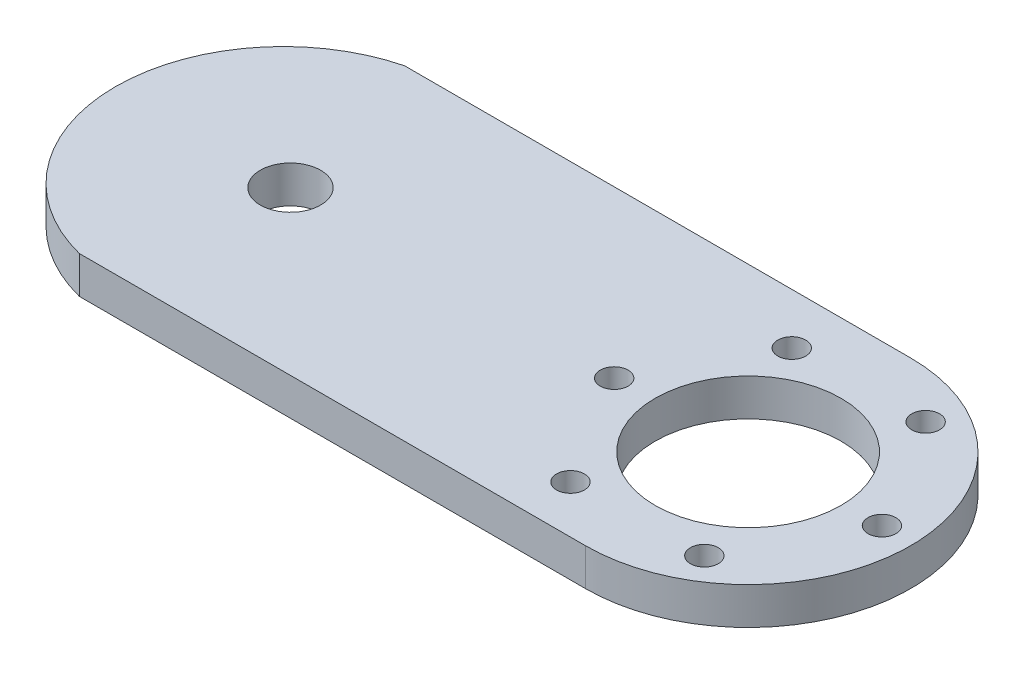
ISO-10303-21;
HEADER;
FILE_DESCRIPTION(('STEP AP214'),'2;1');
FILE_NAME('part.step','',(''),(''),'','','');
FILE_SCHEMA(('AUTOMOTIVE_DESIGN { 1 0 10303 214 1 1 1 1 }'));
ENDSEC;
DATA;
#1=APPLICATION_CONTEXT('core data for automotive mechanical design processes');
#2=APPLICATION_PROTOCOL_DEFINITION('international standard','automotive_design',2000,#1);
#3=PRODUCT_CONTEXT('',#1,'mechanical');
#4=PRODUCT('Part','Part','',(#3));
#5=PRODUCT_RELATED_PRODUCT_CATEGORY('part','',(#4));
#6=PRODUCT_DEFINITION_FORMATION('','',#4);
#7=PRODUCT_DEFINITION_CONTEXT('part definition',#1,'design');
#8=PRODUCT_DEFINITION('design','',#6,#7);
#9=PRODUCT_DEFINITION_SHAPE('','',#8);
#10=(LENGTH_UNIT() NAMED_UNIT(*) SI_UNIT(.MILLI.,.METRE.));
#11=(NAMED_UNIT(*) PLANE_ANGLE_UNIT() SI_UNIT($,.RADIAN.));
#12=(NAMED_UNIT(*) SI_UNIT($,.STERADIAN.) SOLID_ANGLE_UNIT());
#13=UNCERTAINTY_MEASURE_WITH_UNIT(LENGTH_MEASURE(1.E-05),#10,'distance_accuracy_value','');
#14=(GEOMETRIC_REPRESENTATION_CONTEXT(3) GLOBAL_UNCERTAINTY_ASSIGNED_CONTEXT((#13)) GLOBAL_UNIT_ASSIGNED_CONTEXT((#10,
#11,#12)) REPRESENTATION_CONTEXT('',''));
#15=CARTESIAN_POINT('',(0.,0.,0.));
#16=DIRECTION('',(0.,0.,1.));
#17=DIRECTION('',(1.,0.,0.));
#18=AXIS2_PLACEMENT_3D('',#15,#16,#17);
#19=CARTESIAN_POINT('',(110.672099026258,8.,16.4833865027268));
#20=DIRECTION('',(0.,1.,0.));
#21=DIRECTION('',(0.,0.,1.));
#22=AXIS2_PLACEMENT_3D('',#19,#20,#21);
#23=PLANE('',#22);
#24=CARTESIAN_POINT('',(82.5123393071386,8.,17.1509572820945));
#25=DIRECTION('',(0.,1.,0.));
#26=DIRECTION('',(0.,0.,1.));
#27=AXIS2_PLACEMENT_3D('',#24,#25,#26);
#28=CIRCLE('',#27,3.00000000000001);
#29=CARTESIAN_POINT('',(82.5123393071386,8.,20.1509572820945));
#30=VERTEX_POINT('',#29);
#31=EDGE_CURVE('E135',#30,#30,#28,.T.);
#32=ORIENTED_EDGE('',*,*,#31,.F.);
#33=EDGE_LOOP('',(#32));
#34=FACE_BOUND('',#33,.T.);
#35=CARTESIAN_POINT('',(97.1613591782707,8.,41.2077127985249));
#36=DIRECTION('',(0.,1.,0.));
#37=DIRECTION('',(0.,0.,1.));
#38=AXIS2_PLACEMENT_3D('',#35,#36,#37);
#39=CIRCLE('',#38,2.99999999999999);
#40=CARTESIAN_POINT('',(97.1613591782707,8.,44.2077127985248));
#41=VERTEX_POINT('',#40);
#42=EDGE_CURVE('E125',#41,#41,#39,.T.);
#43=ORIENTED_EDGE('',*,*,#42,.F.);
#44=EDGE_LOOP('',(#43));
#45=FACE_BOUND('',#44,.T.);
#46=CARTESIAN_POINT('',(125.319630523697,8.,40.5496672077967));
#47=DIRECTION('',(0.,1.,0.));
#48=DIRECTION('',(0.,0.,1.));
#49=AXIS2_PLACEMENT_3D('',#46,#47,#48);
#50=CIRCLE('',#49,2.99999999999999);
#51=CARTESIAN_POINT('',(125.319630523697,8.,43.5496672077967));
#52=VERTEX_POINT('',#51);
#53=EDGE_CURVE('E122',#52,#52,#50,.T.);
#54=ORIENTED_EDGE('',*,*,#53,.F.);
#55=EDGE_LOOP('',(#54));
#56=FACE_BOUND('',#55,.T.);
#57=CARTESIAN_POINT('',(138.828881997991,8.,15.834866100638));
#58=DIRECTION('',(0.,1.,0.));
#59=DIRECTION('',(0.,0.,1.));
#60=AXIS2_PLACEMENT_3D('',#57,#58,#59);
#61=CIRCLE('',#60,2.99999999999999);
#62=CARTESIAN_POINT('',(138.828881997991,8.,18.834866100638));
#63=VERTEX_POINT('',#62);
#64=EDGE_CURVE('E119',#63,#63,#61,.T.);
#65=ORIENTED_EDGE('',*,*,#64,.F.);
#66=EDGE_LOOP('',(#65));
#67=FACE_BOUND('',#66,.T.);
#68=CARTESIAN_POINT('',(124.179862126859,8.,-8.22188941579235));
#69=DIRECTION('',(0.,1.,0.));
#70=DIRECTION('',(0.,0.,1.));
#71=AXIS2_PLACEMENT_3D('',#68,#69,#70);
#72=CIRCLE('',#71,3.00000000000002);
#73=CARTESIAN_POINT('',(124.179862126859,8.,-5.22188941579233));
#74=VERTEX_POINT('',#73);
#75=EDGE_CURVE('E115',#74,#74,#72,.T.);
#76=ORIENTED_EDGE('',*,*,#75,.F.);
#77=EDGE_LOOP('',(#76));
#78=FACE_BOUND('',#77,.T.);
#79=CARTESIAN_POINT('',(96.0215907814327,8.,-7.56384382506414));
#80=DIRECTION('',(0.,1.,0.));
#81=DIRECTION('',(0.,0.,1.));
#82=AXIS2_PLACEMENT_3D('',#79,#80,#81);
#83=CIRCLE('',#82,3.00000000000001);
#84=CARTESIAN_POINT('',(96.0215907814327,8.,-4.56384382506413));
#85=VERTEX_POINT('',#84);
#86=EDGE_CURVE('E111',#85,#85,#83,.T.);
#87=ORIENTED_EDGE('',*,*,#86,.F.);
#88=EDGE_LOOP('',(#87));
#89=FACE_BOUND('',#88,.T.);
#90=CARTESIAN_POINT('',(110.670387558773,8.,16.4833865027268));
#91=DIRECTION('',(0.,1.,0.));
#92=DIRECTION('',(0.,0.,1.));
#93=AXIS2_PLACEMENT_3D('',#90,#91,#92);
#94=CIRCLE('',#93,20.);
#95=CARTESIAN_POINT('',(110.670387558773,8.,36.4833865027268));
#96=VERTEX_POINT('',#95);
#97=EDGE_CURVE('E101',#96,#96,#94,.T.);
#98=ORIENTED_EDGE('',*,*,#97,.F.);
#99=EDGE_LOOP('',(#98));
#100=FACE_BOUND('',#99,.T.);
#101=CARTESIAN_POINT('',(110.672099026258,8.,16.4833865027268));
#102=DIRECTION('',(0.,1.,0.));
#103=DIRECTION('',(0.,0.,1.));
#104=AXIS2_PLACEMENT_3D('',#101,#102,#103);
#105=CIRCLE('',#104,35.);
#106=CARTESIAN_POINT('',(110.672099026258,8.,51.4833865027268));
#107=VERTEX_POINT('',#106);
#108=CARTESIAN_POINT('',(110.672099026258,8.,-18.5166134972732));
#109=VERTEX_POINT('',#108);
#110=EDGE_CURVE('E85',#107,#109,#105,.T.);
#111=ORIENTED_EDGE('',*,*,#110,.T.);
#112=DIRECTION('',(-1.,0.,0.));
#113=VECTOR('',#112,1.);
#114=CARTESIAN_POINT('',(1.73855637381506,8.,-18.5166134972733));
#115=LINE('',#114,#113);
#116=CARTESIAN_POINT('',(1.73855637381505,8.,-18.5166134972732));
#117=VERTEX_POINT('',#116);
#118=EDGE_CURVE('E80',#109,#117,#115,.T.);
#119=ORIENTED_EDGE('',*,*,#118,.T.);
#120=CARTESIAN_POINT('',(10.6068033832549,8.,16.4833865027268));
#121=DIRECTION('',(0.,1.,0.));
#122=DIRECTION('',(0.,0.,-1.));
#123=AXIS2_PLACEMENT_3D('',#120,#121,#122);
#124=CIRCLE('',#123,36.1060355760701);
#125=CARTESIAN_POINT('',(1.73855637381506,8.,51.4833865027268));
#126=VERTEX_POINT('',#125);
#127=EDGE_CURVE('E83',#117,#126,#124,.T.);
#128=ORIENTED_EDGE('',*,*,#127,.T.);
#129=DIRECTION('',(1.,0.,0.));
#130=VECTOR('',#129,1.);
#131=CARTESIAN_POINT('',(1.73855637381506,8.,51.4833865027268));
#132=LINE('',#131,#130);
#133=EDGE_CURVE('E50',#126,#107,#132,.T.);
#134=ORIENTED_EDGE('',*,*,#133,.T.);
#135=EDGE_LOOP('',(#111,#119,#128,#134));
#136=FACE_BOUND('',#135,.T.);
#137=CARTESIAN_POINT('',(12.1653256458956,8.,16.4833865027268));
#138=DIRECTION('',(0.,1.,0.));
#139=DIRECTION('',(0.,0.,1.));
#140=AXIS2_PLACEMENT_3D('',#137,#138,#139);
#141=CIRCLE('',#140,6.5);
#142=CARTESIAN_POINT('',(12.1653256458956,8.,22.9833865027268));
#143=VERTEX_POINT('',#142);
#144=EDGE_CURVE('E144',#143,#143,#141,.T.);
#145=ORIENTED_EDGE('',*,*,#144,.F.);
#146=EDGE_LOOP('',(#145));
#147=FACE_BOUND('',#146,.T.);
#148=ADVANCED_FACE('F31',(#34,#45,#56,#67,#78,#89,#100,#136,#147),#23,.T.);
#149=CARTESIAN_POINT('',(110.672099026258,0.,16.4833865027268));
#150=DIRECTION('',(0.,1.,0.));
#151=DIRECTION('',(0.,0.,1.));
#152=AXIS2_PLACEMENT_3D('',#149,#150,#151);
#153=PLANE('',#152);
#154=CARTESIAN_POINT('',(82.5123393071386,0.,17.1509572820945));
#155=DIRECTION('',(0.,1.,0.));
#156=DIRECTION('',(0.,0.,1.));
#157=AXIS2_PLACEMENT_3D('',#154,#155,#156);
#158=CIRCLE('',#157,3.00000000000001);
#159=CARTESIAN_POINT('',(82.5123393071386,0.,20.1509572820945));
#160=VERTEX_POINT('',#159);
#161=EDGE_CURVE('E35',#160,#160,#158,.T.);
#162=ORIENTED_EDGE('',*,*,#161,.T.);
#163=EDGE_LOOP('',(#162));
#164=FACE_BOUND('',#163,.T.);
#165=CARTESIAN_POINT('',(97.1613591782707,0.,41.2077127985249));
#166=DIRECTION('',(0.,1.,0.));
#167=DIRECTION('',(0.,0.,1.));
#168=AXIS2_PLACEMENT_3D('',#165,#166,#167);
#169=CIRCLE('',#168,2.99999999999999);
#170=CARTESIAN_POINT('',(97.1613591782707,0.,44.2077127985248));
#171=VERTEX_POINT('',#170);
#172=EDGE_CURVE('E123',#171,#171,#169,.T.);
#173=ORIENTED_EDGE('',*,*,#172,.T.);
#174=EDGE_LOOP('',(#173));
#175=FACE_BOUND('',#174,.T.);
#176=CARTESIAN_POINT('',(125.319630523697,0.,40.5496672077967));
#177=DIRECTION('',(0.,1.,0.));
#178=DIRECTION('',(0.,0.,1.));
#179=AXIS2_PLACEMENT_3D('',#176,#177,#178);
#180=CIRCLE('',#179,2.99999999999999);
#181=CARTESIAN_POINT('',(125.319630523697,0.,43.5496672077967));
#182=VERTEX_POINT('',#181);
#183=EDGE_CURVE('E120',#182,#182,#180,.T.);
#184=ORIENTED_EDGE('',*,*,#183,.T.);
#185=EDGE_LOOP('',(#184));
#186=FACE_BOUND('',#185,.T.);
#187=CARTESIAN_POINT('',(138.828881997991,0.,15.834866100638));
#188=DIRECTION('',(0.,1.,0.));
#189=DIRECTION('',(0.,0.,1.));
#190=AXIS2_PLACEMENT_3D('',#187,#188,#189);
#191=CIRCLE('',#190,2.99999999999999);
#192=CARTESIAN_POINT('',(138.828881997991,0.,18.834866100638));
#193=VERTEX_POINT('',#192);
#194=EDGE_CURVE('E116',#193,#193,#191,.T.);
#195=ORIENTED_EDGE('',*,*,#194,.T.);
#196=EDGE_LOOP('',(#195));
#197=FACE_BOUND('',#196,.T.);
#198=CARTESIAN_POINT('',(124.179862126859,0.,-8.22188941579235));
#199=DIRECTION('',(0.,1.,0.));
#200=DIRECTION('',(0.,0.,1.));
#201=AXIS2_PLACEMENT_3D('',#198,#199,#200);
#202=CIRCLE('',#201,3.00000000000002);
#203=CARTESIAN_POINT('',(124.179862126859,0.,-5.22188941579233));
#204=VERTEX_POINT('',#203);
#205=EDGE_CURVE('E112',#204,#204,#202,.T.);
#206=ORIENTED_EDGE('',*,*,#205,.T.);
#207=EDGE_LOOP('',(#206));
#208=FACE_BOUND('',#207,.T.);
#209=CARTESIAN_POINT('',(96.0215907814327,0.,-7.56384382506414));
#210=DIRECTION('',(0.,1.,0.));
#211=DIRECTION('',(0.,0.,1.));
#212=AXIS2_PLACEMENT_3D('',#209,#210,#211);
#213=CIRCLE('',#212,3.00000000000001);
#214=CARTESIAN_POINT('',(96.0215907814327,0.,-4.56384382506413));
#215=VERTEX_POINT('',#214);
#216=EDGE_CURVE('E107',#215,#215,#213,.T.);
#217=ORIENTED_EDGE('',*,*,#216,.T.);
#218=EDGE_LOOP('',(#217));
#219=FACE_BOUND('',#218,.T.);
#220=CARTESIAN_POINT('',(110.670387558773,0.,16.4833865027268));
#221=DIRECTION('',(0.,1.,0.));
#222=DIRECTION('',(0.,0.,1.));
#223=AXIS2_PLACEMENT_3D('',#220,#221,#222);
#224=CIRCLE('',#223,20.);
#225=CARTESIAN_POINT('',(110.670387558773,0.,36.4833865027268));
#226=VERTEX_POINT('',#225);
#227=EDGE_CURVE('E147',#226,#226,#224,.T.);
#228=ORIENTED_EDGE('',*,*,#227,.T.);
#229=EDGE_LOOP('',(#228));
#230=FACE_BOUND('',#229,.T.);
#231=CARTESIAN_POINT('',(110.672099026258,0.,16.4833865027268));
#232=DIRECTION('',(0.,1.,0.));
#233=DIRECTION('',(0.,0.,1.));
#234=AXIS2_PLACEMENT_3D('',#231,#232,#233);
#235=CIRCLE('',#234,35.);
#236=CARTESIAN_POINT('',(110.672099026258,0.,51.4833865027268));
#237=VERTEX_POINT('',#236);
#238=CARTESIAN_POINT('',(110.672099026258,0.,-18.5166134972732));
#239=VERTEX_POINT('',#238);
#240=EDGE_CURVE('E98',#237,#239,#235,.T.);
#241=ORIENTED_EDGE('',*,*,#240,.F.);
#242=DIRECTION('',(1.,0.,0.));
#243=VECTOR('',#242,1.);
#244=CARTESIAN_POINT('',(1.73855637381506,0.,51.4833865027268));
#245=LINE('',#244,#243);
#246=CARTESIAN_POINT('',(1.73855637381506,0.,51.4833865027268));
#247=VERTEX_POINT('',#246);
#248=EDGE_CURVE('E73',#247,#237,#245,.T.);
#249=ORIENTED_EDGE('',*,*,#248,.F.);
#250=CARTESIAN_POINT('',(10.6068033832549,0.,16.4833865027268));
#251=DIRECTION('',(0.,1.,0.));
#252=DIRECTION('',(0.,0.,-1.));
#253=AXIS2_PLACEMENT_3D('',#250,#251,#252);
#254=CIRCLE('',#253,36.1060355760701);
#255=CARTESIAN_POINT('',(1.73855637381505,0.,-18.5166134972732));
#256=VERTEX_POINT('',#255);
#257=EDGE_CURVE('E67',#256,#247,#254,.T.);
#258=ORIENTED_EDGE('',*,*,#257,.F.);
#259=DIRECTION('',(-1.,0.,0.));
#260=VECTOR('',#259,1.);
#261=CARTESIAN_POINT('',(1.73855637381506,0.,-18.5166134972733));
#262=LINE('',#261,#260);
#263=EDGE_CURVE('E89',#239,#256,#262,.T.);
#264=ORIENTED_EDGE('',*,*,#263,.F.);
#265=EDGE_LOOP('',(#241,#249,#258,#264));
#266=FACE_BOUND('',#265,.T.);
#267=CARTESIAN_POINT('',(12.1653256458956,0.,16.4833865027268));
#268=DIRECTION('',(0.,1.,0.));
#269=DIRECTION('',(0.,0.,1.));
#270=AXIS2_PLACEMENT_3D('',#267,#268,#269);
#271=CIRCLE('',#270,6.5);
#272=CARTESIAN_POINT('',(12.1653256458956,0.,22.9833865027268));
#273=VERTEX_POINT('',#272);
#274=EDGE_CURVE('E110',#273,#273,#271,.T.);
#275=ORIENTED_EDGE('',*,*,#274,.T.);
#276=EDGE_LOOP('',(#275));
#277=FACE_BOUND('',#276,.T.);
#278=ADVANCED_FACE('F155',(#164,#175,#186,#197,#208,#219,#230,#266,#277),#153,.F.);
#279=CARTESIAN_POINT('',(110.672099026258,8.,16.4833865027268));
#280=DIRECTION('',(0.,-1.,0.));
#281=DIRECTION('',(0.,0.,-1.));
#282=AXIS2_PLACEMENT_3D('',#279,#280,#281);
#283=CYLINDRICAL_SURFACE('',#282,35.);
#284=ORIENTED_EDGE('',*,*,#240,.T.);
#285=DIRECTION('',(0.,-1.,0.));
#286=VECTOR('',#285,1.);
#287=CARTESIAN_POINT('',(110.672099026258,8.,-18.5166134972732));
#288=LINE('',#287,#286);
#289=EDGE_CURVE('E11',#109,#239,#288,.T.);
#290=ORIENTED_EDGE('',*,*,#289,.F.);
#291=ORIENTED_EDGE('',*,*,#110,.F.);
#292=DIRECTION('',(0.,-1.,0.));
#293=VECTOR('',#292,1.);
#294=CARTESIAN_POINT('',(110.672099026258,8.,51.4833865027268));
#295=LINE('',#294,#293);
#296=EDGE_CURVE('E94',#107,#237,#295,.T.);
#297=ORIENTED_EDGE('',*,*,#296,.T.);
#298=EDGE_LOOP('',(#284,#290,#291,#297));
#299=FACE_BOUND('',#298,.T.);
#300=ADVANCED_FACE('F33',(#299),#283,.T.);
#301=CARTESIAN_POINT('',(1.73855637381506,8.,-18.5166134972733));
#302=DIRECTION('',(0.,0.,1.));
#303=DIRECTION('',(1.,0.,0.));
#304=AXIS2_PLACEMENT_3D('',#301,#302,#303);
#305=PLANE('',#304);
#306=ORIENTED_EDGE('',*,*,#263,.T.);
#307=DIRECTION('',(0.,-1.,0.));
#308=VECTOR('',#307,1.);
#309=CARTESIAN_POINT('',(1.73855637381505,8.,-18.5166134972732));
#310=LINE('',#309,#308);
#311=EDGE_CURVE('E41',#117,#256,#310,.T.);
#312=ORIENTED_EDGE('',*,*,#311,.F.);
#313=ORIENTED_EDGE('',*,*,#118,.F.);
#314=ORIENTED_EDGE('',*,*,#289,.T.);
#315=EDGE_LOOP('',(#306,#312,#313,#314));
#316=FACE_BOUND('',#315,.T.);
#317=ADVANCED_FACE('F88',(#316),#305,.F.);
#318=CARTESIAN_POINT('',(10.6068033832549,8.,16.4833865027268));
#319=DIRECTION('',(0.,-1.,0.));
#320=DIRECTION('',(0.,0.,-1.));
#321=AXIS2_PLACEMENT_3D('',#318,#319,#320);
#322=CYLINDRICAL_SURFACE('',#321,36.1060355760701);
#323=ORIENTED_EDGE('',*,*,#257,.T.);
#324=DIRECTION('',(0.,-1.,0.));
#325=VECTOR('',#324,1.);
#326=CARTESIAN_POINT('',(1.73855637381506,8.,51.4833865027268));
#327=LINE('',#326,#325);
#328=EDGE_CURVE('E90',#126,#247,#327,.T.);
#329=ORIENTED_EDGE('',*,*,#328,.F.);
#330=ORIENTED_EDGE('',*,*,#127,.F.);
#331=ORIENTED_EDGE('',*,*,#311,.T.);
#332=EDGE_LOOP('',(#323,#329,#330,#331));
#333=FACE_BOUND('',#332,.T.);
#334=ADVANCED_FACE('F92',(#333),#322,.T.);
#335=CARTESIAN_POINT('',(1.73855637381506,8.,51.4833865027268));
#336=DIRECTION('',(0.,0.,-1.));
#337=DIRECTION('',(-1.,0.,0.));
#338=AXIS2_PLACEMENT_3D('',#335,#336,#337);
#339=PLANE('',#338);
#340=ORIENTED_EDGE('',*,*,#248,.T.);
#341=ORIENTED_EDGE('',*,*,#296,.F.);
#342=ORIENTED_EDGE('',*,*,#133,.F.);
#343=ORIENTED_EDGE('',*,*,#328,.T.);
#344=EDGE_LOOP('',(#340,#341,#342,#343));
#345=FACE_BOUND('',#344,.T.);
#346=ADVANCED_FACE('F161',(#345),#339,.F.);
#347=CARTESIAN_POINT('',(110.670387558773,8.,16.4833865027268));
#348=DIRECTION('',(0.,-1.,0.));
#349=DIRECTION('',(0.,0.,-1.));
#350=AXIS2_PLACEMENT_3D('',#347,#348,#349);
#351=CYLINDRICAL_SURFACE('',#350,20.);
#352=ORIENTED_EDGE('',*,*,#97,.T.);
#353=EDGE_LOOP('',(#352));
#354=FACE_BOUND('',#353,.T.);
#355=ORIENTED_EDGE('',*,*,#227,.F.);
#356=EDGE_LOOP('',(#355));
#357=FACE_BOUND('',#356,.T.);
#358=ADVANCED_FACE('F158',(#354,#357),#351,.F.);
#359=CARTESIAN_POINT('',(12.1653256458956,8.,16.4833865027268));
#360=DIRECTION('',(0.,-1.,0.));
#361=DIRECTION('',(0.,0.,-1.));
#362=AXIS2_PLACEMENT_3D('',#359,#360,#361);
#363=CYLINDRICAL_SURFACE('',#362,6.5);
#364=ORIENTED_EDGE('',*,*,#144,.T.);
#365=EDGE_LOOP('',(#364));
#366=FACE_BOUND('',#365,.T.);
#367=ORIENTED_EDGE('',*,*,#274,.F.);
#368=EDGE_LOOP('',(#367));
#369=FACE_BOUND('',#368,.T.);
#370=ADVANCED_FACE('F160',(#366,#369),#363,.F.);
#371=CARTESIAN_POINT('',(96.0215907814327,-2.,-7.56384382506414));
#372=DIRECTION('',(0.,1.,0.));
#373=DIRECTION('',(0.,0.,1.));
#374=AXIS2_PLACEMENT_3D('',#371,#372,#373);
#375=CYLINDRICAL_SURFACE('',#374,3.00000000000001);
#376=ORIENTED_EDGE('',*,*,#86,.T.);
#377=EDGE_LOOP('',(#376));
#378=FACE_BOUND('',#377,.T.);
#379=ORIENTED_EDGE('',*,*,#216,.F.);
#380=EDGE_LOOP('',(#379));
#381=FACE_BOUND('',#380,.T.);
#382=ADVANCED_FACE('F168',(#378,#381),#375,.F.);
#383=CARTESIAN_POINT('',(124.179862126859,-2.,-8.22188941579235));
#384=DIRECTION('',(0.,1.,0.));
#385=DIRECTION('',(0.,0.,1.));
#386=AXIS2_PLACEMENT_3D('',#383,#384,#385);
#387=CYLINDRICAL_SURFACE('',#386,3.00000000000002);
#388=ORIENTED_EDGE('',*,*,#75,.T.);
#389=EDGE_LOOP('',(#388));
#390=FACE_BOUND('',#389,.T.);
#391=ORIENTED_EDGE('',*,*,#205,.F.);
#392=EDGE_LOOP('',(#391));
#393=FACE_BOUND('',#392,.T.);
#394=ADVANCED_FACE('F213',(#390,#393),#387,.F.);
#395=CARTESIAN_POINT('',(138.828881997991,-2.,15.834866100638));
#396=DIRECTION('',(0.,1.,0.));
#397=DIRECTION('',(0.,0.,1.));
#398=AXIS2_PLACEMENT_3D('',#395,#396,#397);
#399=CYLINDRICAL_SURFACE('',#398,2.99999999999999);
#400=ORIENTED_EDGE('',*,*,#64,.T.);
#401=EDGE_LOOP('',(#400));
#402=FACE_BOUND('',#401,.T.);
#403=ORIENTED_EDGE('',*,*,#194,.F.);
#404=EDGE_LOOP('',(#403));
#405=FACE_BOUND('',#404,.T.);
#406=ADVANCED_FACE('F224',(#402,#405),#399,.F.);
#407=CARTESIAN_POINT('',(125.319630523697,-2.,40.5496672077967));
#408=DIRECTION('',(0.,1.,0.));
#409=DIRECTION('',(0.,0.,1.));
#410=AXIS2_PLACEMENT_3D('',#407,#408,#409);
#411=CYLINDRICAL_SURFACE('',#410,2.99999999999999);
#412=ORIENTED_EDGE('',*,*,#53,.T.);
#413=EDGE_LOOP('',(#412));
#414=FACE_BOUND('',#413,.T.);
#415=ORIENTED_EDGE('',*,*,#183,.F.);
#416=EDGE_LOOP('',(#415));
#417=FACE_BOUND('',#416,.T.);
#418=ADVANCED_FACE('F234',(#414,#417),#411,.F.);
#419=CARTESIAN_POINT('',(97.1613591782707,-2.,41.2077127985249));
#420=DIRECTION('',(0.,1.,0.));
#421=DIRECTION('',(0.,0.,1.));
#422=AXIS2_PLACEMENT_3D('',#419,#420,#421);
#423=CYLINDRICAL_SURFACE('',#422,2.99999999999999);
#424=ORIENTED_EDGE('',*,*,#42,.T.);
#425=EDGE_LOOP('',(#424));
#426=FACE_BOUND('',#425,.T.);
#427=ORIENTED_EDGE('',*,*,#172,.F.);
#428=EDGE_LOOP('',(#427));
#429=FACE_BOUND('',#428,.T.);
#430=ADVANCED_FACE('F244',(#426,#429),#423,.F.);
#431=CARTESIAN_POINT('',(82.5123393071386,-2.,17.1509572820945));
#432=DIRECTION('',(0.,1.,0.));
#433=DIRECTION('',(0.,0.,1.));
#434=AXIS2_PLACEMENT_3D('',#431,#432,#433);
#435=CYLINDRICAL_SURFACE('',#434,3.00000000000001);
#436=ORIENTED_EDGE('',*,*,#31,.T.);
#437=EDGE_LOOP('',(#436));
#438=FACE_BOUND('',#437,.T.);
#439=ORIENTED_EDGE('',*,*,#161,.F.);
#440=EDGE_LOOP('',(#439));
#441=FACE_BOUND('',#440,.T.);
#442=ADVANCED_FACE('F254',(#438,#441),#435,.F.);
#443=CLOSED_SHELL('',(#148,#278,#300,#317,#334,#346,#358,#370,#382,#394,#406,#418,#430,#442));
#444=MANIFOLD_SOLID_BREP('B2',#443);
#445=ADVANCED_BREP_SHAPE_REPRESENTATION('',(#18,#444),#14);
#446=SHAPE_DEFINITION_REPRESENTATION(#9,#445);
ENDSEC;
END-ISO-10303-21;
